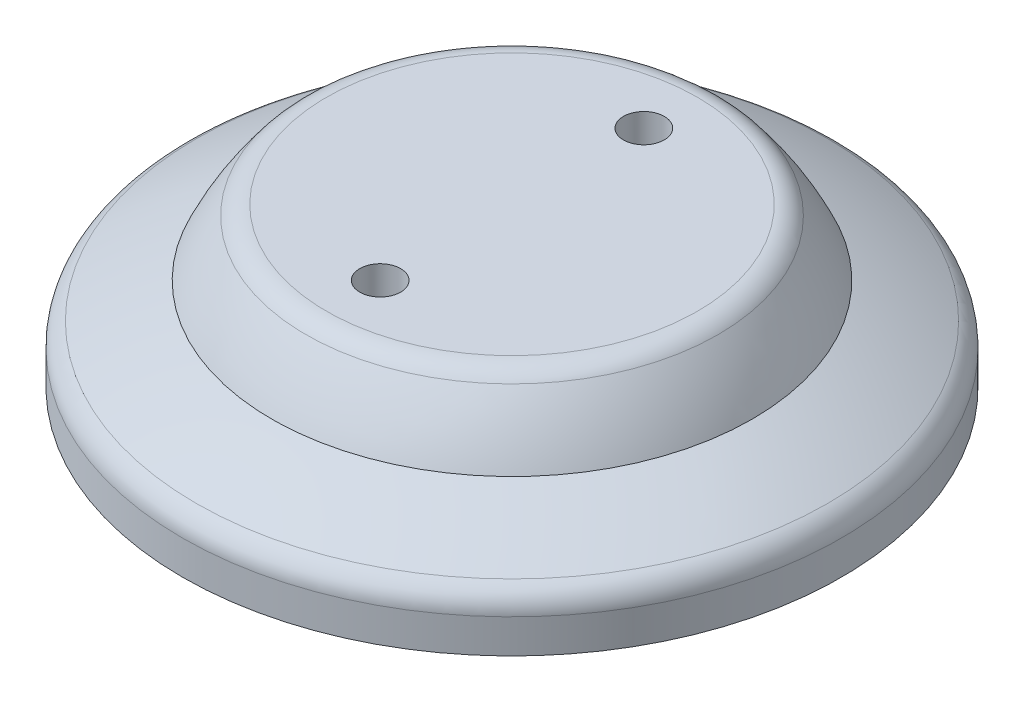
ISO-10303-21;
HEADER;
FILE_DESCRIPTION(('STEP AP214'),'2;1');
FILE_NAME('part.step','',(''),(''),'','','');
FILE_SCHEMA(('AUTOMOTIVE_DESIGN { 1 0 10303 214 1 1 1 1 }'));
ENDSEC;
DATA;
#1=APPLICATION_CONTEXT('core data for automotive mechanical design processes');
#2=APPLICATION_PROTOCOL_DEFINITION('international standard','automotive_design',2000,#1);
#3=PRODUCT_CONTEXT('',#1,'mechanical');
#4=PRODUCT('Part','Part','',(#3));
#5=PRODUCT_RELATED_PRODUCT_CATEGORY('part','',(#4));
#6=PRODUCT_DEFINITION_FORMATION('','',#4);
#7=PRODUCT_DEFINITION_CONTEXT('part definition',#1,'design');
#8=PRODUCT_DEFINITION('design','',#6,#7);
#9=PRODUCT_DEFINITION_SHAPE('','',#8);
#10=(LENGTH_UNIT() NAMED_UNIT(*) SI_UNIT(.MILLI.,.METRE.));
#11=(NAMED_UNIT(*) PLANE_ANGLE_UNIT() SI_UNIT($,.RADIAN.));
#12=(NAMED_UNIT(*) SI_UNIT($,.STERADIAN.) SOLID_ANGLE_UNIT());
#13=UNCERTAINTY_MEASURE_WITH_UNIT(LENGTH_MEASURE(1.E-05),#10,'distance_accuracy_value','');
#14=(GEOMETRIC_REPRESENTATION_CONTEXT(3) GLOBAL_UNCERTAINTY_ASSIGNED_CONTEXT((#13)) GLOBAL_UNIT_ASSIGNED_CONTEXT((#10,
#11,#12)) REPRESENTATION_CONTEXT('',''));
#15=CARTESIAN_POINT('',(0.,0.,0.));
#16=DIRECTION('',(0.,0.,1.));
#17=DIRECTION('',(1.,0.,0.));
#18=AXIS2_PLACEMENT_3D('',#15,#16,#17);
#19=CARTESIAN_POINT('',(0.,12.,0.));
#20=DIRECTION('',(0.,-1.,0.));
#21=DIRECTION('',(0.,0.,-1.));
#22=AXIS2_PLACEMENT_3D('',#19,#20,#21);
#23=PLANE('',#22);
#24=CARTESIAN_POINT('',(0.,12.,0.));
#25=DIRECTION('',(0.,-1.,0.));
#26=DIRECTION('',(0.,0.,-1.));
#27=AXIS2_PLACEMENT_3D('',#24,#25,#26);
#28=CIRCLE('',#27,14.068227543699);
#29=CARTESIAN_POINT('',(0.,12.,-14.068227543699));
#30=VERTEX_POINT('',#29);
#31=EDGE_CURVE('E45',#30,#30,#28,.F.);
#32=ORIENTED_EDGE('',*,*,#31,.T.);
#33=EDGE_LOOP('',(#32));
#34=FACE_BOUND('',#33,.T.);
#35=CARTESIAN_POINT('',(0.,12.,-10.));
#36=DIRECTION('',(0.,-1.,0.));
#37=DIRECTION('',(0.,0.,-1.));
#38=AXIS2_PLACEMENT_3D('',#35,#36,#37);
#39=CIRCLE('',#38,1.55);
#40=CARTESIAN_POINT('',(0.,12.,-11.55));
#41=VERTEX_POINT('',#40);
#42=EDGE_CURVE('E55',#41,#41,#39,.T.);
#43=ORIENTED_EDGE('',*,*,#42,.T.);
#44=EDGE_LOOP('',(#43));
#45=FACE_BOUND('',#44,.T.);
#46=CARTESIAN_POINT('',(0.,12.,10.));
#47=DIRECTION('',(0.,-1.,0.));
#48=DIRECTION('',(0.,0.,-1.));
#49=AXIS2_PLACEMENT_3D('',#46,#47,#48);
#50=CIRCLE('',#49,1.55);
#51=CARTESIAN_POINT('',(0.,12.,8.45));
#52=VERTEX_POINT('',#51);
#53=EDGE_CURVE('E59',#52,#52,#50,.T.);
#54=ORIENTED_EDGE('',*,*,#53,.T.);
#55=EDGE_LOOP('',(#54));
#56=FACE_BOUND('',#55,.T.);
#57=ADVANCED_FACE('F34',(#34,#45,#56),#23,.F.);
#58=CARTESIAN_POINT('',(0.,-1.22875655532296,0.));
#59=DIRECTION('',(0.,-1.,0.));
#60=DIRECTION('',(1.,0.,0.));
#61=AXIS2_PLACEMENT_3D('',#58,#59,#60);
#62=SPHERICAL_SURFACE('',#61,20.);
#63=CARTESIAN_POINT('',(0.,11.2476396172581,0.));
#64=DIRECTION('',(0.,-1.,0.));
#65=DIRECTION('',(0.,0.,-1.));
#66=AXIS2_PLACEMENT_3D('',#63,#64,#65);
#67=CIRCLE('',#66,15.6313639374434);
#68=CARTESIAN_POINT('',(15.6313639374434,11.2476396172581,0.));
#69=VERTEX_POINT('',#68);
#70=EDGE_CURVE('E49',#69,#69,#67,.T.);
#71=CARTESIAN_POINT('',(0.,7.,0.));
#72=DIRECTION('',(0.,-1.,0.));
#73=DIRECTION('',(0.,0.,-1.));
#74=AXIS2_PLACEMENT_3D('',#71,#72,#73);
#75=CIRCLE('',#74,18.228756555323);
#76=CARTESIAN_POINT('',(18.228756555323,7.,0.));
#77=VERTEX_POINT('',#76);
#78=EDGE_CURVE('E75',#77,#77,#75,.T.);
#79=CARTESIAN_POINT('',(15.6313639374434,11.2476396172581,0.));
#80=CARTESIAN_POINT('',(15.663801213109,11.2069997749948,0.));
#81=CARTESIAN_POINT('',(15.6960799931759,11.1662334272843,0.));
#82=CARTESIAN_POINT('',(15.7603186137479,11.0844502129928,0.));
#83=CARTESIAN_POINT('',(15.7922784542529,11.0434333464119,0.));
#84=CARTESIAN_POINT('',(15.8558772473369,10.9611515864037,0.));
#85=CARTESIAN_POINT('',(15.8875161999158,10.9198866929764,0.));
#86=CARTESIAN_POINT('',(15.9504712935032,10.8371113904715,0.));
#87=CARTESIAN_POINT('',(15.9817874345117,10.7956009813939,0.));
#88=CARTESIAN_POINT('',(16.044094999559,10.7123371726263,0.));
#89=CARTESIAN_POINT('',(16.0750864235977,10.6705837729363,0.));
#90=CARTESIAN_POINT('',(16.1367426694337,10.5868365230571,0.));
#91=CARTESIAN_POINT('',(16.1674074912308,10.5448426728679,0.));
#92=CARTESIAN_POINT('',(16.2284086670802,10.4606170766528,0.));
#93=CARTESIAN_POINT('',(16.2587450211324,10.4183853306269,0.));
#94=CARTESIAN_POINT('',(16.3190874159978,10.333686511894,0.));
#95=CARTESIAN_POINT('',(16.3490934568109,10.2912194391871,0.));
#96=CARTESIAN_POINT('',(16.408773399791,10.2060525505583,0.));
#97=CARTESIAN_POINT('',(16.438447301958,10.1633527346364,0.));
#98=CARTESIAN_POINT('',(16.4974611624464,10.0777229572043,0.));
#99=CARTESIAN_POINT('',(16.5268011207679,10.034792995694,0.));
#100=CARTESIAN_POINT('',(16.5851453086804,9.94870553871186,0.));
#101=CARTESIAN_POINT('',(16.6141495382715,9.90554804324002,0.));
#102=CARTESIAN_POINT('',(16.6718205042629,9.81900814380369,0.));
#103=CARTESIAN_POINT('',(16.7004872406631,9.7756257398392,0.));
#104=CARTESIAN_POINT('',(16.7574814763432,9.6886386625687,0.));
#105=CARTESIAN_POINT('',(16.7858089756231,9.64503398926268,0.));
#106=CARTESIAN_POINT('',(16.8421230137705,9.55760502598191,0.));
#107=CARTESIAN_POINT('',(16.8701095526381,9.51378073600714,0.));
#108=CARTESIAN_POINT('',(16.925739967411,9.42591520542194,0.));
#109=CARTESIAN_POINT('',(16.9533838433163,9.38187396481151,0.));
#110=CARTESIAN_POINT('',(17.0083272504608,9.29357721218614,0.));
#111=CARTESIAN_POINT('',(17.0356267816998,9.2493217001712,0.));
#112=CARTESIAN_POINT('',(17.0898798387557,9.16059909700314,0.));
#113=CARTESIAN_POINT('',(17.1168333645725,9.11613200585,0.));
#114=CARTESIAN_POINT('',(17.1703927710768,9.02698894954315,0.));
#115=CARTESIAN_POINT('',(17.1969986517644,8.98231298438944,0.));
#116=CARTESIAN_POINT('',(17.2498611494522,8.89275489792582,0.));
#117=CARTESIAN_POINT('',(17.2761177664525,8.84787277661592,0.));
#118=CARTESIAN_POINT('',(17.3282801394551,8.75790510822575,0.));
#119=CARTESIAN_POINT('',(17.3541858954574,8.71281956114548,0.));
#120=CARTESIAN_POINT('',(17.4056449704977,8.62244778397571,0.));
#121=CARTESIAN_POINT('',(17.4311982895357,8.57716155388621,0.));
#122=CARTESIAN_POINT('',(17.4819509361215,8.4863911656676,0.));
#123=CARTESIAN_POINT('',(17.5071502636694,8.44090700753849,0.));
#124=CARTESIAN_POINT('',(17.5571933942839,8.34974353025113,0.));
#125=CARTESIAN_POINT('',(17.5820371973505,8.30406421109288,0.));
#126=CARTESIAN_POINT('',(17.6313677676401,8.21251319063032,0.));
#127=CARTESIAN_POINT('',(17.6558545348629,8.16664148932602,0.));
#128=CARTESIAN_POINT('',(17.7044695438217,8.07470849515765,0.));
#129=CARTESIAN_POINT('',(17.7285977855576,8.0286472022936,0.));
#130=CARTESIAN_POINT('',(17.7764942757123,7.93633782712678,0.));
#131=CARTESIAN_POINT('',(17.8002625241312,7.89008974482403,0.));
#132=CARTESIAN_POINT('',(17.8474375817134,7.79740960426031,0.));
#133=CARTESIAN_POINT('',(17.8708443908768,7.75097754599934,0.));
#134=CARTESIAN_POINT('',(17.9172951460287,7.65793227820607,0.));
#135=CARTESIAN_POINT('',(17.9403390920172,7.61131906867375,0.));
#136=CARTESIAN_POINT('',(17.986062718859,7.51791433399167,0.));
#137=CARTESIAN_POINT('',(18.0087423997124,7.4711228088419,0.));
#138=CARTESIAN_POINT('',(18.0537361169146,7.37736428962522,0.));
#139=CARTESIAN_POINT('',(18.0760501532634,7.3303972955583,0.));
#140=CARTESIAN_POINT('',(18.1203112227225,7.23629069514081,0.));
#141=CARTESIAN_POINT('',(18.1422582558326,7.18915108879025,0.));
#142=CARTESIAN_POINT('',(18.1857839884105,7.09470213370666,0.));
#143=CARTESIAN_POINT('',(18.2073626878783,7.04739278497364,0.));
#144=CARTESIAN_POINT('',(18.228756555323,7.,0.));
#145=B_SPLINE_CURVE_WITH_KNOTS('',3,(#79,#80,#81,#82,#83,#84,#85,#86,#87,#88,#89,#90,#91,#92,
#93,#94,#95,#96,#97,#98,#99,#100,#101,#102,#103,#104,#105,#106,#107,#108,#109,#110,#111,#112,
#113,#114,#115,#116,#117,#118,#119,#120,#121,#122,#123,#124,#125,#126,#127,#128,#129,#130,#131,
#132,#133,#134,#135,#136,#137,#138,#139,#140,#141,#142,#143,#144),.UNSPECIFIED.,.F.,.F.,(4,2,2,
2,2,2,2,2,2,2,2,2,2,2,2,2,2,2,2,2,2,2,2,2,2,2,2,2,2,2,2,2,4),(0.,0.1559930745009,
0.311986149001795,0.467979223502693,0.623972298003591,0.779965372504489,0.935958447005386,
1.09195152150628,1.24794459600718,1.40393767050808,1.55993074500897,1.71592381950987,
1.87191689401077,2.02790996851167,2.18390304301257,2.33989611751347,2.49588919201436,
2.65188226651526,2.80787534101616,2.96386841551706,3.11986149001796,3.27585456451885,
3.43184763901975,3.58784071352065,3.74383378802154,3.89982686252244,4.05581993702334,
4.21181301152424,4.36780608602514,4.52379916052603,4.67979223502693,4.83578530952783,
4.99177838402873),.UNSPECIFIED.);
#146=EDGE_CURVE('BSEAM110',#69,#77,#145,.T.);
#147=ORIENTED_EDGE('',*,*,#70,.T.);
#148=ORIENTED_EDGE('',*,*,#78,.F.);
#149=ORIENTED_EDGE('',*,*,#146,.T.);
#150=ORIENTED_EDGE('',*,*,#146,.F.);
#151=EDGE_LOOP('',(#147,#149,#148,#150));
#152=FACE_BOUND('',#151,.T.);
#153=ADVANCED_FACE('F110',(#152),#62,.T.);
#154=CARTESIAN_POINT('',(0.,-39.5586988053443,0.));
#155=DIRECTION('',(0.,-1.,0.));
#156=DIRECTION('',(1.,0.,0.));
#157=AXIS2_PLACEMENT_3D('',#154,#155,#156);
#158=SPHERICAL_SURFACE('',#157,50.);
#159=CARTESIAN_POINT('',(0.,4.32749792994921,0.));
#160=DIRECTION('',(0.,-1.,0.));
#161=DIRECTION('',(0.,0.,-1.));
#162=AXIS2_PLACEMENT_3D('',#159,#160,#161);
#163=CIRCLE('',#162,23.9583333333333);
#164=CARTESIAN_POINT('',(23.9583333333333,4.32749792994922,0.));
#165=VERTEX_POINT('',#164);
#166=EDGE_CURVE('E11',#165,#165,#163,.F.);
#167=CARTESIAN_POINT('',(23.9583333333333,4.32749792994922,0.));
#168=CARTESIAN_POINT('',(23.9004910746039,4.35907515137776,0.));
#169=CARTESIAN_POINT('',(23.8425863867532,4.3905380168989,0.));
#170=CARTESIAN_POINT('',(23.7266530596329,4.45323454705476,0.));
#171=CARTESIAN_POINT('',(23.6686244203634,4.48446821168948,0.));
#172=CARTESIAN_POINT('',(23.5524440972291,4.5467058510009,0.));
#173=CARTESIAN_POINT('',(23.4942924133643,4.57770982567759,0.));
#174=CARTESIAN_POINT('',(23.3778669103063,4.63948760055254,0.));
#175=CARTESIAN_POINT('',(23.319593091113,4.67026140075079,0.));
#176=CARTESIAN_POINT('',(23.2029242284349,4.73157834548975,0.));
#177=CARTESIAN_POINT('',(23.14452918495,4.76212149003047,0.));
#178=CARTESIAN_POINT('',(23.0276187866583,4.82297664595033,0.));
#179=CARTESIAN_POINT('',(22.9691034318514,4.85328865732947,0.));
#180=CARTESIAN_POINT('',(22.8519533257561,4.91368107301727,0.));
#181=CARTESIAN_POINT('',(22.7933185744676,4.94376147732594,0.));
#182=CARTESIAN_POINT('',(22.6759305921191,5.00369020858981,0.));
#183=CARTESIAN_POINT('',(22.617177361059,5.03353853554503,0.));
#184=CARTESIAN_POINT('',(22.4995533377286,5.09300264544607,0.));
#185=CARTESIAN_POINT('',(22.4406825454583,5.1226184283919,0.));
#186=CARTESIAN_POINT('',(22.3228243201071,5.18161698725421,0.));
#187=CARTESIAN_POINT('',(22.2638368870263,5.21099976317071,0.));
#188=CARTESIAN_POINT('',(22.1457463022772,5.26953184859722,0.));
#189=CARTESIAN_POINT('',(22.086643150609,5.29868115810725,0.));
#190=CARTESIAN_POINT('',(21.9683220527175,5.35674585499376,0.));
#191=CARTESIAN_POINT('',(21.9091041064943,5.38566124237025,0.));
#192=CARTESIAN_POINT('',(21.79055434532,5.44325764291983,0.));
#193=CARTESIAN_POINT('',(21.7312225303689,5.47193865609293,0.));
#194=CARTESIAN_POINT('',(21.6124459593461,5.52906585983011,0.));
#195=CARTESIAN_POINT('',(21.5530012032744,5.5575120503942,0.));
#196=CARTESIAN_POINT('',(21.4339996793837,5.61416916417904,0.));
#197=CARTESIAN_POINT('',(21.3744429115645,5.64238008739978,0.));
#198=CARTESIAN_POINT('',(21.2552182953031,5.69856622544182,0.));
#199=CARTESIAN_POINT('',(21.1955504468609,5.72654144026312,0.));
#200=CARTESIAN_POINT('',(21.0761046022141,5.78225572413527,0.));
#201=CARTESIAN_POINT('',(21.0163266060097,5.80999479318612,0.));
#202=CARTESIAN_POINT('',(20.8966614004216,5.86523635183835,0.));
#203=CARTESIAN_POINT('',(20.8367741910381,5.89273884143973,0.));
#204=CARTESIAN_POINT('',(20.7168914953823,5.94750681121271,0.));
#205=CARTESIAN_POINT('',(20.65689600911,5.97477229138431,0.));
#206=CARTESIAN_POINT('',(20.5367976976603,6.02906581602291,0.));
#207=CARTESIAN_POINT('',(20.4766948724828,6.05609386048991,0.));
#208=CARTESIAN_POINT('',(20.356382822884,6.10991209115658,0.));
#209=CARTESIAN_POINT('',(20.2961735984627,6.13670227735626,0.));
#210=CARTESIAN_POINT('',(20.1756496917013,6.19004437264431,0.));
#211=CARTESIAN_POINT('',(20.1153350093612,6.21659628173269,0.));
#212=CARTESIAN_POINT('',(19.9946011297358,6.26946140767945,0.));
#213=CARTESIAN_POINT('',(19.9341819324506,6.29577462453783,0.));
#214=CARTESIAN_POINT('',(19.8132399675427,6.34816195463768,0.));
#215=CARTESIAN_POINT('',(19.7527171999201,6.37423606787915,0.));
#216=CARTESIAN_POINT('',(19.6315690405645,6.42614478309636,0.));
#217=CARTESIAN_POINT('',(19.5709436488315,6.45197938507211,0.));
#218=CARTESIAN_POINT('',(19.4495911890866,6.50340867385403,0.));
#219=CARTESIAN_POINT('',(19.3888641210747,6.5290033606602,0.));
#220=CARTESIAN_POINT('',(19.2673092581926,6.5799524189486,0.));
#221=CARTESIAN_POINT('',(19.2064814633224,6.60530679043082,0.));
#222=CARTESIAN_POINT('',(19.0847260977213,6.65577482167933,0.));
#223=CARTESIAN_POINT('',(19.0237985269903,6.6808884814456,0.));
#224=CARTESIAN_POINT('',(18.9018445622173,6.73087469661405,0.));
#225=CARTESIAN_POINT('',(18.8408181681752,6.75574725201622,0.));
#226=CARTESIAN_POINT('',(18.7186675109035,6.80525086965061,0.));
#227=CARTESIAN_POINT('',(18.6575432476738,6.82988193188284,0.));
#228=CARTESIAN_POINT('',(18.5351978075728,6.87890217787513,0.));
#229=CARTESIAN_POINT('',(18.4739766307015,6.90329136163521,0.));
#230=CARTESIAN_POINT('',(18.3514383207803,6.95182747017747,0.));
#231=CARTESIAN_POINT('',(18.2901211877305,6.97597439495965,0.));
#232=CARTESIAN_POINT('',(18.2287565553229,7.00000000000001,0.));
#233=B_SPLINE_CURVE_WITH_KNOTS('',3,(#167,#168,#169,#170,#171,#172,#173,#174,#175,#176,#177,
#178,#179,#180,#181,#182,#183,#184,#185,#186,#187,#188,#189,#190,#191,#192,#193,#194,#195,#196,
#197,#198,#199,#200,#201,#202,#203,#204,#205,#206,#207,#208,#209,#210,#211,#212,#213,#214,#215,
#216,#217,#218,#219,#220,#221,#222,#223,#224,#225,#226,#227,#228,#229,#230,#231,#232),
.UNSPECIFIED.,.F.,.F.,(4,2,2,2,2,2,2,2,2,2,2,2,2,2,2,2,2,2,2,2,2,2,2,2,2,2,2,2,2,2,2,2,4),(0.,
0.19770073178026,0.395401463560526,0.59310219534079,0.790802927121051,0.98850365890132,
1.18620439068158,1.38390512246184,1.58160585424211,1.77930658602237,1.97700731780263,
2.1747080495829,2.37240878136316,2.57010951314342,2.76781024492369,2.96551097670395,
3.16321170848422,3.36091244026448,3.55861317204474,3.75631390382501,3.95401463560527,
4.15171536738553,4.3494160991658,4.54711683094606,4.74481756272633,4.94251829450659,
5.14021902628686,5.33791975806712,5.53562048984738,5.73332122162764,5.93102195340791,
6.12872268518817,6.32642341696844),.UNSPECIFIED.);
#234=EDGE_CURVE('BSEAM108',#165,#77,#233,.T.);
#235=ORIENTED_EDGE('',*,*,#166,.T.);
#236=ORIENTED_EDGE('',*,*,#78,.T.);
#237=ORIENTED_EDGE('',*,*,#234,.T.);
#238=ORIENTED_EDGE('',*,*,#234,.F.);
#239=EDGE_LOOP('',(#235,#237,#236,#238));
#240=FACE_BOUND('',#239,.T.);
#241=ADVANCED_FACE('F108',(#240),#158,.T.);
#242=CARTESIAN_POINT('',(0.,0.,0.));
#243=DIRECTION('',(0.,-1.,0.));
#244=DIRECTION('',(0.,0.,-1.));
#245=AXIS2_PLACEMENT_3D('',#242,#243,#244);
#246=CYLINDRICAL_SURFACE('',#245,25.);
#247=CARTESIAN_POINT('',(0.,2.57205006053747,0.));
#248=DIRECTION('',(0.,-1.,0.));
#249=DIRECTION('',(0.,0.,-1.));
#250=AXIS2_PLACEMENT_3D('',#247,#248,#249);
#251=CIRCLE('',#250,25.);
#252=CARTESIAN_POINT('',(0.,2.57205006053747,-25.));
#253=VERTEX_POINT('',#252);
#254=EDGE_CURVE('E41',#253,#253,#251,.T.);
#255=ORIENTED_EDGE('',*,*,#254,.T.);
#256=EDGE_LOOP('',(#255));
#257=FACE_BOUND('',#256,.T.);
#258=CARTESIAN_POINT('',(0.,0.,0.));
#259=DIRECTION('',(0.,-1.,0.));
#260=DIRECTION('',(0.,0.,-1.));
#261=AXIS2_PLACEMENT_3D('',#258,#259,#260);
#262=CIRCLE('',#261,25.);
#263=CARTESIAN_POINT('',(0.,0.,-25.));
#264=VERTEX_POINT('',#263);
#265=EDGE_CURVE('E82',#264,#264,#262,.T.);
#266=ORIENTED_EDGE('',*,*,#265,.F.);
#267=EDGE_LOOP('',(#266));
#268=FACE_BOUND('',#267,.T.);
#269=ADVANCED_FACE('F103',(#257,#268),#246,.T.);
#270=CARTESIAN_POINT('',(0.,0.,0.));
#271=DIRECTION('',(0.,-1.,0.));
#272=DIRECTION('',(0.,0.,-1.));
#273=AXIS2_PLACEMENT_3D('',#270,#271,#272);
#274=PLANE('',#273);
#275=CARTESIAN_POINT('',(0.,0.,0.));
#276=DIRECTION('',(0.,-1.,0.));
#277=DIRECTION('',(0.,0.,-1.));
#278=AXIS2_PLACEMENT_3D('',#275,#276,#277);
#279=CIRCLE('',#278,23.5);
#280=CARTESIAN_POINT('',(0.,0.,-23.5));
#281=VERTEX_POINT('',#280);
#282=EDGE_CURVE('E58',#281,#281,#279,.T.);
#283=ORIENTED_EDGE('',*,*,#282,.F.);
#284=EDGE_LOOP('',(#283));
#285=FACE_BOUND('',#284,.T.);
#286=ORIENTED_EDGE('',*,*,#265,.T.);
#287=EDGE_LOOP('',(#286));
#288=FACE_BOUND('',#287,.T.);
#289=ADVANCED_FACE('F99',(#285,#288),#274,.T.);
#290=CARTESIAN_POINT('',(0.,-8.62670273047588,10.));
#291=DIRECTION('',(0.,1.,0.));
#292=DIRECTION('',(0.,0.,1.));
#293=AXIS2_PLACEMENT_3D('',#290,#291,#292);
#294=CYLINDRICAL_SURFACE('',#293,1.55);
#295=CARTESIAN_POINT('',(0.,1.5,10.));
#296=DIRECTION('',(0.,-1.,0.));
#297=DIRECTION('',(1.,0.,0.));
#298=AXIS2_PLACEMENT_3D('',#295,#296,#297);
#299=CIRCLE('',#298,1.55);
#300=CARTESIAN_POINT('',(1.55,1.5,10.));
#301=VERTEX_POINT('',#300);
#302=EDGE_CURVE('E62',#301,#301,#299,.F.);
#303=ORIENTED_EDGE('',*,*,#302,.F.);
#304=EDGE_LOOP('',(#303));
#305=FACE_BOUND('',#304,.T.);
#306=ORIENTED_EDGE('',*,*,#53,.F.);
#307=EDGE_LOOP('',(#306));
#308=FACE_BOUND('',#307,.T.);
#309=ADVANCED_FACE('F102',(#305,#308),#294,.F.);
#310=CARTESIAN_POINT('',(0.,-8.62670273047588,-10.));
#311=DIRECTION('',(0.,1.,0.));
#312=DIRECTION('',(0.,0.,1.));
#313=AXIS2_PLACEMENT_3D('',#310,#311,#312);
#314=CYLINDRICAL_SURFACE('',#313,1.55);
#315=CARTESIAN_POINT('',(0.,1.5,-10.));
#316=DIRECTION('',(0.,-1.,0.));
#317=DIRECTION('',(1.,0.,0.));
#318=AXIS2_PLACEMENT_3D('',#315,#316,#317);
#319=CIRCLE('',#318,1.55);
#320=CARTESIAN_POINT('',(1.55,1.5,-10.));
#321=VERTEX_POINT('',#320);
#322=EDGE_CURVE('E69',#321,#321,#319,.F.);
#323=ORIENTED_EDGE('',*,*,#322,.F.);
#324=EDGE_LOOP('',(#323));
#325=FACE_BOUND('',#324,.T.);
#326=ORIENTED_EDGE('',*,*,#42,.F.);
#327=EDGE_LOOP('',(#326));
#328=FACE_BOUND('',#327,.T.);
#329=ADVANCED_FACE('F148',(#325,#328),#314,.F.);
#330=CARTESIAN_POINT('',(0.,10.,0.));
#331=DIRECTION('',(0.,-1.,0.));
#332=DIRECTION('',(0.,0.,-1.));
#333=AXIS2_PLACEMENT_3D('',#330,#331,#332);
#334=TOROIDAL_SURFACE('',#333,14.068227543699,2.);
#335=ORIENTED_EDGE('',*,*,#31,.F.);
#336=EDGE_LOOP('',(#335));
#337=FACE_BOUND('',#336,.T.);
#338=ORIENTED_EDGE('',*,*,#70,.F.);
#339=EDGE_LOOP('',(#338));
#340=FACE_BOUND('',#339,.T.);
#341=ADVANCED_FACE('F155',(#337,#340),#334,.T.);
#342=CARTESIAN_POINT('',(0.,2.57205006053747,0.));
#343=DIRECTION('',(0.,-1.,0.));
#344=DIRECTION('',(0.,0.,-1.));
#345=AXIS2_PLACEMENT_3D('',#342,#343,#344);
#346=TOROIDAL_SURFACE('',#345,23.,2.);
#347=ORIENTED_EDGE('',*,*,#166,.F.);
#348=EDGE_LOOP('',(#347));
#349=FACE_BOUND('',#348,.T.);
#350=ORIENTED_EDGE('',*,*,#254,.F.);
#351=EDGE_LOOP('',(#350));
#352=FACE_BOUND('',#351,.T.);
#353=ADVANCED_FACE('F36',(#349,#352),#346,.T.);
#354=CARTESIAN_POINT('',(0.,1.5,0.));
#355=DIRECTION('',(0.,-1.,0.));
#356=DIRECTION('',(0.,0.,-1.));
#357=AXIS2_PLACEMENT_3D('',#354,#355,#356);
#358=PLANE('',#357);
#359=CARTESIAN_POINT('',(0.,1.5,10.));
#360=DIRECTION('',(0.,-1.,0.));
#361=DIRECTION('',(1.,0.,0.));
#362=AXIS2_PLACEMENT_3D('',#359,#360,#361);
#363=CIRCLE('',#362,3.05);
#364=CARTESIAN_POINT('',(3.05,1.5,10.));
#365=VERTEX_POINT('',#364);
#366=EDGE_CURVE('E70',#365,#365,#363,.F.);
#367=ORIENTED_EDGE('',*,*,#366,.F.);
#368=EDGE_LOOP('',(#367));
#369=FACE_BOUND('',#368,.T.);
#370=ORIENTED_EDGE('',*,*,#302,.T.);
#371=EDGE_LOOP('',(#370));
#372=FACE_BOUND('',#371,.T.);
#373=ADVANCED_FACE('F157',(#369,#372),#358,.T.);
#374=CARTESIAN_POINT('',(0.,1.5,-10.));
#375=DIRECTION('',(0.,-1.,0.));
#376=DIRECTION('',(1.,0.,0.));
#377=AXIS2_PLACEMENT_3D('',#374,#375,#376);
#378=CIRCLE('',#377,3.05);
#379=CARTESIAN_POINT('',(3.05,1.5,-10.));
#380=VERTEX_POINT('',#379);
#381=EDGE_CURVE('E66',#380,#380,#378,.F.);
#382=ORIENTED_EDGE('',*,*,#381,.F.);
#383=EDGE_LOOP('',(#382));
#384=FACE_BOUND('',#383,.T.);
#385=ORIENTED_EDGE('',*,*,#322,.T.);
#386=EDGE_LOOP('',(#385));
#387=FACE_BOUND('',#386,.T.);
#388=ADVANCED_FACE('F128',(#384,#387),#358,.T.);
#389=CARTESIAN_POINT('',(14.3068609298467,10.5,0.));
#390=DIRECTION('',(0.,1.,0.));
#391=DIRECTION('',(-1.,0.,0.));
#392=AXIS2_PLACEMENT_3D('',#389,#390,#391);
#393=PLANE('',#392);
#394=CARTESIAN_POINT('',(0.,10.5,-10.));
#395=DIRECTION('',(0.,1.,0.));
#396=DIRECTION('',(-1.,0.,0.));
#397=AXIS2_PLACEMENT_3D('',#394,#395,#396);
#398=CIRCLE('',#397,3.05);
#399=CARTESIAN_POINT('',(-3.05,10.5,-10.));
#400=VERTEX_POINT('',#399);
#401=EDGE_CURVE('E54',#400,#400,#398,.F.);
#402=ORIENTED_EDGE('',*,*,#401,.F.);
#403=EDGE_LOOP('',(#402));
#404=FACE_BOUND('',#403,.T.);
#405=CARTESIAN_POINT('',(0.,10.5,10.));
#406=DIRECTION('',(0.,1.,0.));
#407=DIRECTION('',(-1.,0.,0.));
#408=AXIS2_PLACEMENT_3D('',#405,#406,#407);
#409=CIRCLE('',#408,3.05);
#410=CARTESIAN_POINT('',(-3.05,10.5,10.));
#411=VERTEX_POINT('',#410);
#412=EDGE_CURVE('E65',#411,#411,#409,.F.);
#413=ORIENTED_EDGE('',*,*,#412,.F.);
#414=EDGE_LOOP('',(#413));
#415=FACE_BOUND('',#414,.T.);
#416=CARTESIAN_POINT('',(0.,10.5,0.));
#417=DIRECTION('',(0.,-1.,0.));
#418=DIRECTION('',(1.,0.,0.));
#419=AXIS2_PLACEMENT_3D('',#416,#417,#418);
#420=CIRCLE('',#419,14.3068609298467);
#421=CARTESIAN_POINT('',(14.3068609298467,10.5,0.));
#422=VERTEX_POINT('',#421);
#423=EDGE_CURVE('E91',#422,#422,#420,.T.);
#424=ORIENTED_EDGE('',*,*,#423,.T.);
#425=EDGE_LOOP('',(#424));
#426=FACE_BOUND('',#425,.T.);
#427=ADVANCED_FACE('F125',(#404,#415,#426),#393,.F.);
#428=CARTESIAN_POINT('',(0.,10.5,0.));
#429=DIRECTION('',(0.,-1.,0.));
#430=DIRECTION('',(1.,0.,0.));
#431=AXIS2_PLACEMENT_3D('',#428,#429,#430);
#432=CYLINDRICAL_SURFACE('',#431,23.5);
#433=CARTESIAN_POINT('',(0.,2.86770806584853,0.));
#434=DIRECTION('',(0.,-1.,0.));
#435=DIRECTION('',(1.,0.,0.));
#436=AXIS2_PLACEMENT_3D('',#433,#434,#435);
#437=CIRCLE('',#436,23.5);
#438=CARTESIAN_POINT('',(23.5,2.86770806584853,0.));
#439=VERTEX_POINT('',#438);
#440=EDGE_CURVE('E85',#439,#439,#437,.T.);
#441=ORIENTED_EDGE('',*,*,#440,.F.);
#442=EDGE_LOOP('',(#441));
#443=FACE_BOUND('',#442,.T.);
#444=ORIENTED_EDGE('',*,*,#282,.T.);
#445=EDGE_LOOP('',(#444));
#446=FACE_BOUND('',#445,.T.);
#447=ADVANCED_FACE('F97',(#443,#446),#432,.F.);
#448=CARTESIAN_POINT('',(0.,-39.5586988053443,0.));
#449=DIRECTION('',(0.,-1.,0.));
#450=DIRECTION('',(1.,0.,0.));
#451=AXIS2_PLACEMENT_3D('',#448,#449,#450);
#452=SPHERICAL_SURFACE('',#451,48.5);
#453=CARTESIAN_POINT('',(0.,5.82598309941426,0.));
#454=DIRECTION('',(0.,-1.,0.));
#455=DIRECTION('',(1.,0.,0.));
#456=AXIS2_PLACEMENT_3D('',#453,#454,#455);
#457=CIRCLE('',#456,17.1020656180439);
#458=CARTESIAN_POINT('',(17.1020656180439,5.82598309941426,0.));
#459=VERTEX_POINT('',#458);
#460=EDGE_CURVE('E88',#459,#459,#457,.T.);
#461=CARTESIAN_POINT('',(17.1020656180439,5.82598309941426,0.));
#462=CARTESIAN_POINT('',(17.1708344650516,5.80006930593751,0.));
#463=CARTESIAN_POINT('',(17.2395444126264,5.77399920785923,0.));
#464=CARTESIAN_POINT('',(17.376845091056,5.72154694628821,0.));
#465=CARTESIAN_POINT('',(17.4454358219109,5.69516478279548,0.));
#466=CARTESIAN_POINT('',(17.5824966490466,5.64208893418415,0.));
#467=CARTESIAN_POINT('',(17.6509667453274,5.61539524906555,0.));
#468=CARTESIAN_POINT('',(17.7877848886135,5.56169690915612,0.));
#469=CARTESIAN_POINT('',(17.8561329356189,5.53469225436528,0.));
#470=CARTESIAN_POINT('',(17.9927055679979,5.48037253302775,0.));
#471=CARTESIAN_POINT('',(18.0609301533715,5.45305746648107,0.));
#472=CARTESIAN_POINT('',(18.1972544527294,5.39811748608653,0.));
#473=CARTESIAN_POINT('',(18.2653541667137,5.37049257223869,0.));
#474=CARTESIAN_POINT('',(18.4014273161028,5.31493346806585,0.));
#475=CARTESIAN_POINT('',(18.4694007515077,5.28699927774086,0.));
#476=CARTESIAN_POINT('',(18.6052199391606,5.23082219783745,0.));
#477=CARTESIAN_POINT('',(18.6730656914086,5.20257930825901,0.));
#478=CARTESIAN_POINT('',(18.8086281108082,5.14578541344887,0.));
#479=CARTESIAN_POINT('',(18.8763447779597,5.11723440821716,0.));
#480=CARTESIAN_POINT('',(19.0116476278938,5.05982487206804,0.));
#481=CARTESIAN_POINT('',(19.0792338106765,5.03096634115064,0.));
#482=CARTESIAN_POINT('',(19.2142742952971,4.97294234995216,0.));
#483=CARTESIAN_POINT('',(19.281728597135,4.94377688967108,0.));
#484=CARTESIAN_POINT('',(19.4165039260152,4.88513964240957,0.));
#485=CARTESIAN_POINT('',(19.4838249530575,4.85566785542914,0.));
#486=CARTESIAN_POINT('',(19.6183323412495,4.7964185637631,0.));
#487=CARTESIAN_POINT('',(19.6855187023992,4.76664105907748,0.));
#488=CARTESIAN_POINT('',(19.819755370492,4.70678094731243,0.));
#489=CARTESIAN_POINT('',(19.886805677435,4.67669834023301,0.));
#490=CARTESIAN_POINT('',(20.0207688516114,4.61622864529625,0.));
#491=CARTESIAN_POINT('',(20.0876817188448,4.58584155743893,0.));
#492=CARTESIAN_POINT('',(20.2213686309392,4.52476352885396,0.));
#493=CARTESIAN_POINT('',(20.2881426758002,4.49407258812632,0.));
#494=CARTESIAN_POINT('',(20.4215505633555,4.43238748798702,0.));
#495=CARTESIAN_POINT('',(20.4881844060498,4.40139332857536,0.));
#496=CARTESIAN_POINT('',(20.6213105123746,4.33910243151991,0.));
#497=CARTESIAN_POINT('',(20.6878027760051,4.30780569387612,0.));
#498=CARTESIAN_POINT('',(20.8206443502305,4.24491028706068,0.));
#499=CARTESIAN_POINT('',(20.8869936608254,4.21331161788903,0.));
#500=CARTESIAN_POINT('',(21.0195479579621,4.14981300096111,0.));
#501=CARTESIAN_POINT('',(21.0857529445039,4.11791305320484,0.));
#502=CARTESIAN_POINT('',(21.2180172254987,4.05381253827645,0.));
#503=CARTESIAN_POINT('',(21.2840765199518,4.02161197110433,0.));
#504=CARTESIAN_POINT('',(21.4160480517444,3.95691088272491,0.));
#505=CARTESIAN_POINT('',(21.4819602890839,3.92441036151761,0.));
#506=CARTESIAN_POINT('',(21.6136363446631,3.85911003664661,0.));
#507=CARTESIAN_POINT('',(21.6794001629029,3.82631023298292,0.));
#508=CARTESIAN_POINT('',(21.8107780213633,3.76041202096221,0.));
#509=CARTESIAN_POINT('',(21.8763920615839,3.72731361260521,0.));
#510=CARTESIAN_POINT('',(22.0074690081818,3.66081887513108,0.));
#511=CARTESIAN_POINT('',(22.0729319145589,3.62742254601396,0.));
#512=CARTESIAN_POINT('',(22.2037052407687,3.56033265710951,0.));
#513=CARTESIAN_POINT('',(22.2690156606012,3.52663909732219,0.));
#514=CARTESIAN_POINT('',(22.3994826641703,3.45895544330689,0.));
#515=CARTESIAN_POINT('',(22.4646392479068,3.4249653490789,0.));
#516=CARTESIAN_POINT('',(22.5947972329158,3.35668932854765,0.));
#517=CARTESIAN_POINT('',(22.6597986341883,3.32240340224438,0.));
#518=CARTESIAN_POINT('',(22.7896449110907,3.2535364260097,0.));
#519=CARTESIAN_POINT('',(22.8544897867206,3.21895537607828,0.));
#520=CARTESIAN_POINT('',(22.9840216724575,3.14949886724923,0.));
#521=CARTESIAN_POINT('',(23.0487086825646,3.1146234083516,0.));
#522=CARTESIAN_POINT('',(23.1779235003995,3.04457880190097,0.));
#523=CARTESIAN_POINT('',(23.2424513081273,3.00940965434797,0.));
#524=CARTESIAN_POINT('',(23.3713463885259,2.93877839858818,0.));
#525=CARTESIAN_POINT('',(23.4357136611967,2.9033162903814,0.));
#526=CARTESIAN_POINT('',(23.5,2.86770806584853,0.));
#527=B_SPLINE_CURVE_WITH_KNOTS('',3,(#461,#462,#463,#464,#465,#466,#467,#468,#469,#470,#471,
#472,#473,#474,#475,#476,#477,#478,#479,#480,#481,#482,#483,#484,#485,#486,#487,#488,#489,#490,
#491,#492,#493,#494,#495,#496,#497,#498,#499,#500,#501,#502,#503,#504,#505,#506,#507,#508,#509,
#510,#511,#512,#513,#514,#515,#516,#517,#518,#519,#520,#521,#522,#523,#524,#525,#526),
.UNSPECIFIED.,.F.,.F.,(4,2,2,2,2,2,2,2,2,2,2,2,2,2,2,2,2,2,2,2,2,2,2,2,2,2,2,2,2,2,2,2,4),(0.,
0.22046774683508,0.440935493670154,0.661403240505227,0.881870987340309,1.10233873417539,
1.32280648101046,1.54327422784553,1.76374197468062,1.9842097215157,2.20467746835077,
2.42514521518584,2.64561296202092,2.866080708856,3.08654845569107,3.30701620252615,
3.52748394936123,3.74795169619631,3.96841944303139,4.18888718986646,4.40935493670153,
4.62982268353662,4.85029043037169,5.07075817720676,5.29122592404184,5.51169367087692,
5.732161417712,5.95262916454707,6.17309691138215,6.39356465821723,6.61403240505231,
6.83450015188738,7.05496789872246),.UNSPECIFIED.);
#528=EDGE_CURVE('BSEAM132',#459,#439,#527,.T.);
#529=ORIENTED_EDGE('',*,*,#460,.F.);
#530=ORIENTED_EDGE('',*,*,#440,.T.);
#531=ORIENTED_EDGE('',*,*,#528,.T.);
#532=ORIENTED_EDGE('',*,*,#528,.F.);
#533=EDGE_LOOP('',(#529,#531,#530,#532));
#534=FACE_BOUND('',#533,.T.);
#535=ADVANCED_FACE('F132',(#534),#452,.F.);
#536=CARTESIAN_POINT('',(0.,-1.22875655532296,0.));
#537=DIRECTION('',(0.,-1.,0.));
#538=DIRECTION('',(1.,0.,0.));
#539=AXIS2_PLACEMENT_3D('',#536,#537,#538);
#540=SPHERICAL_SURFACE('',#539,18.5000000000001);
#541=CARTESIAN_POINT('',(14.3068609298467,10.5,0.));
#542=CARTESIAN_POINT('',(14.3429580487021,10.4559683664557,0.));
#543=CARTESIAN_POINT('',(14.3788518837041,10.4117700810889,0.));
#544=CARTESIAN_POINT('',(14.4502299536883,10.3230439966468,0.));
#545=CARTESIAN_POINT('',(14.4857141886707,10.2785161975714,0.));
#546=CARTESIAN_POINT('',(14.5562700263033,10.1891348756487,0.));
#547=CARTESIAN_POINT('',(14.5913416289535,10.1442813528014,0.));
#548=CARTESIAN_POINT('',(14.6610692141411,10.054252408565,0.));
#549=CARTESIAN_POINT('',(14.6957251966785,10.0090769871759,0.));
#550=CARTESIAN_POINT('',(14.7646185867832,9.91840809651063,0.));
#551=CARTESIAN_POINT('',(14.7988559943505,9.8729146272344,0.));
#552=CARTESIAN_POINT('',(14.866909316012,9.78161351910238,0.));
#553=CARTESIAN_POINT('',(14.9007252301062,9.73580588024659,0.));
#554=CARTESIAN_POINT('',(14.9679326820696,9.64388033790037,0.));
#555=CARTESIAN_POINT('',(15.0013242199387,9.59776243440993,0.));
#556=CARTESIAN_POINT('',(15.0676800729252,9.50522029422734,0.));
#557=CARTESIAN_POINT('',(15.1006443880425,9.45879605753517,0.));
#558=CARTESIAN_POINT('',(15.1661429854051,9.36564520848571,0.));
#559=CARTESIAN_POINT('',(15.1986772676505,9.31891859612842,0.));
#560=CARTESIAN_POINT('',(15.2633130258116,9.22516697906476,0.));
#561=CARTESIAN_POINT('',(15.2954145017274,9.17814197435839,0.));
#562=CARTESIAN_POINT('',(15.3591819106666,9.08379758134905,0.));
#563=CARTESIAN_POINT('',(15.3908478436899,9.03647819304608,0.));
#564=CARTESIAN_POINT('',(15.4537414674103,8.94154906669156,0.));
#565=CARTESIAN_POINT('',(15.4849691581074,8.89393932864002,0.));
#566=CARTESIAN_POINT('',(15.5469836351002,8.79843356138789,0.));
#567=CARTESIAN_POINT('',(15.577770421396,8.75053753218729,0.));
#568=CARTESIAN_POINT('',(15.6389004650973,8.65446326564212,0.));
#569=CARTESIAN_POINT('',(15.6692437225028,8.60628502829754,0.));
#570=CARTESIAN_POINT('',(15.729484121744,8.50965045252691,0.));
#571=CARTESIAN_POINT('',(15.7593812635798,8.46119411410086,0.));
#572=CARTESIAN_POINT('',(15.8187268830323,8.36400746693719,0.));
#573=CARTESIAN_POINT('',(15.848175360649,8.31527715819957,0.));
#574=CARTESIAN_POINT('',(15.9066211412615,8.21754672453785,0.));
#575=CARTESIAN_POINT('',(15.9356184442573,8.16854659961374,0.));
#576=CARTESIAN_POINT('',(15.9931594036874,8.07028071070525,0.));
#577=CARTESIAN_POINT('',(16.0217030601218,8.02101494672086,0.));
#578=CARTESIAN_POINT('',(16.0783342931606,7.92222197946298,0.));
#579=CARTESIAN_POINT('',(16.1064218697651,7.87269477618949,0.));
#580=CARTESIAN_POINT('',(16.1621385487554,7.77338315241159,0.));
#581=CARTESIAN_POINT('',(16.1897676511413,7.72359873190718,0.));
#582=CARTESIAN_POINT('',(16.2445650263891,7.62377691765266,0.));
#583=CARTESIAN_POINT('',(16.2717332992511,7.57373952390255,0.));
#584=CARTESIAN_POINT('',(16.3256066994306,7.47341602870717,0.));
#585=CARTESIAN_POINT('',(16.352311826748,7.42312992726189,0.));
#586=CARTESIAN_POINT('',(16.4052566592996,7.3223133034283,0.));
#587=CARTESIAN_POINT('',(16.4314963645336,7.27178278103998,0.));
#588=CARTESIAN_POINT('',(16.4835081160557,7.17048162290878,0.));
#589=CARTESIAN_POINT('',(16.5092801623437,7.11971098716589,0.));
#590=CARTESIAN_POINT('',(16.5603543989766,7.01793393038256,0.));
#591=CARTESIAN_POINT('',(16.5856565893215,6.96692750934212,0.));
#592=CARTESIAN_POINT('',(16.635788957129,6.86468323012248,0.));
#593=CARTESIAN_POINT('',(16.6606191345917,6.81344537194328,0.));
#594=CARTESIAN_POINT('',(16.7098053599183,6.71074258632783,0.));
#595=CARTESIAN_POINT('',(16.7341614077822,6.65927765889157,0.));
#596=CARTESIAN_POINT('',(16.78239729767,6.55612512202489,0.));
#597=CARTESIAN_POINT('',(16.8062771396939,6.50443751259446,0.));
#598=CARTESIAN_POINT('',(16.8535585820429,6.40084401789526,0.));
#599=CARTESIAN_POINT('',(16.876960182368,6.34893813262649,0.));
#600=CARTESIAN_POINT('',(16.9232831470232,6.24491251134998,0.));
#601=CARTESIAN_POINT('',(16.9462045113534,6.19279277534224,0.));
#602=CARTESIAN_POINT('',(16.9915650476987,6.08834389466298,0.));
#603=CARTESIAN_POINT('',(17.0140042197138,6.03601474999146,0.));
#604=CARTESIAN_POINT('',(17.0583984672721,5.93115151659266,0.));
#605=CARTESIAN_POINT('',(17.0803535428153,5.87861742786539,0.));
#606=CARTESIAN_POINT('',(17.102065618044,5.82598309941425,0.));
#607=B_SPLINE_CURVE_WITH_KNOTS('',3,(#541,#542,#543,#544,#545,#546,#547,#548,#549,#550,#551,
#552,#553,#554,#555,#556,#557,#558,#559,#560,#561,#562,#563,#564,#565,#566,#567,#568,#569,#570,
#571,#572,#573,#574,#575,#576,#577,#578,#579,#580,#581,#582,#583,#584,#585,#586,#587,#588,#589,
#590,#591,#592,#593,#594,#595,#596,#597,#598,#599,#600,#601,#602,#603,#604,#605,#606),
.UNSPECIFIED.,.F.,.F.,(4,2,2,2,2,2,2,2,2,2,2,2,2,2,2,2,2,2,2,2,2,2,2,2,2,2,2,2,2,2,2,2,4),(0.,
0.170809465019986,0.34161893003997,0.512428395059957,0.683237860079943,0.854047325099928,
1.02485679011991,1.1956662551399,1.36647572015988,1.53728518517987,1.70809465019985,
1.87890411521984,2.04971358023983,2.22052304525981,2.3913325102798,2.56214197529978,
2.73295144031977,2.90376090533975,3.07457037035974,3.24537983537972,3.41618930039971,
3.5869987654197,3.75780823043968,3.92861769545967,4.09942716047965,4.27023662549964,
4.44104609051962,4.61185555553961,4.78266502055959,4.95347448557958,5.12428395059956,
5.29509341561955,5.46590288063954),.UNSPECIFIED.);
#608=EDGE_CURVE('BSEAM136',#422,#459,#607,.T.);
#609=ORIENTED_EDGE('',*,*,#423,.F.);
#610=ORIENTED_EDGE('',*,*,#460,.T.);
#611=ORIENTED_EDGE('',*,*,#608,.T.);
#612=ORIENTED_EDGE('',*,*,#608,.F.);
#613=EDGE_LOOP('',(#609,#611,#610,#612));
#614=FACE_BOUND('',#613,.T.);
#615=ADVANCED_FACE('F136',(#614),#540,.F.);
#616=CARTESIAN_POINT('',(0.,-8.62670273047588,10.));
#617=DIRECTION('',(0.,1.,0.));
#618=DIRECTION('',(0.,0.,1.));
#619=AXIS2_PLACEMENT_3D('',#616,#617,#618);
#620=CYLINDRICAL_SURFACE('',#619,3.05);
#621=ORIENTED_EDGE('',*,*,#412,.T.);
#622=EDGE_LOOP('',(#621));
#623=FACE_BOUND('',#622,.T.);
#624=ORIENTED_EDGE('',*,*,#366,.T.);
#625=EDGE_LOOP('',(#624));
#626=FACE_BOUND('',#625,.T.);
#627=ADVANCED_FACE('F140',(#623,#626),#620,.T.);
#628=CARTESIAN_POINT('',(0.,-8.62670273047588,-10.));
#629=DIRECTION('',(0.,1.,0.));
#630=DIRECTION('',(0.,0.,1.));
#631=AXIS2_PLACEMENT_3D('',#628,#629,#630);
#632=CYLINDRICAL_SURFACE('',#631,3.05);
#633=ORIENTED_EDGE('',*,*,#401,.T.);
#634=EDGE_LOOP('',(#633));
#635=FACE_BOUND('',#634,.T.);
#636=ORIENTED_EDGE('',*,*,#381,.T.);
#637=EDGE_LOOP('',(#636));
#638=FACE_BOUND('',#637,.T.);
#639=ADVANCED_FACE('F144',(#635,#638),#632,.T.);
#640=CLOSED_SHELL('',(#57,#153,#241,#269,#289,#309,#329,#341,#353,#373,#388,#427,#447,#535,#615,
#627,#639));
#641=MANIFOLD_SOLID_BREP('B2',#640);
#642=ADVANCED_BREP_SHAPE_REPRESENTATION('',(#18,#641),#14);
#643=SHAPE_DEFINITION_REPRESENTATION(#9,#642);
ENDSEC;
END-ISO-10303-21;
